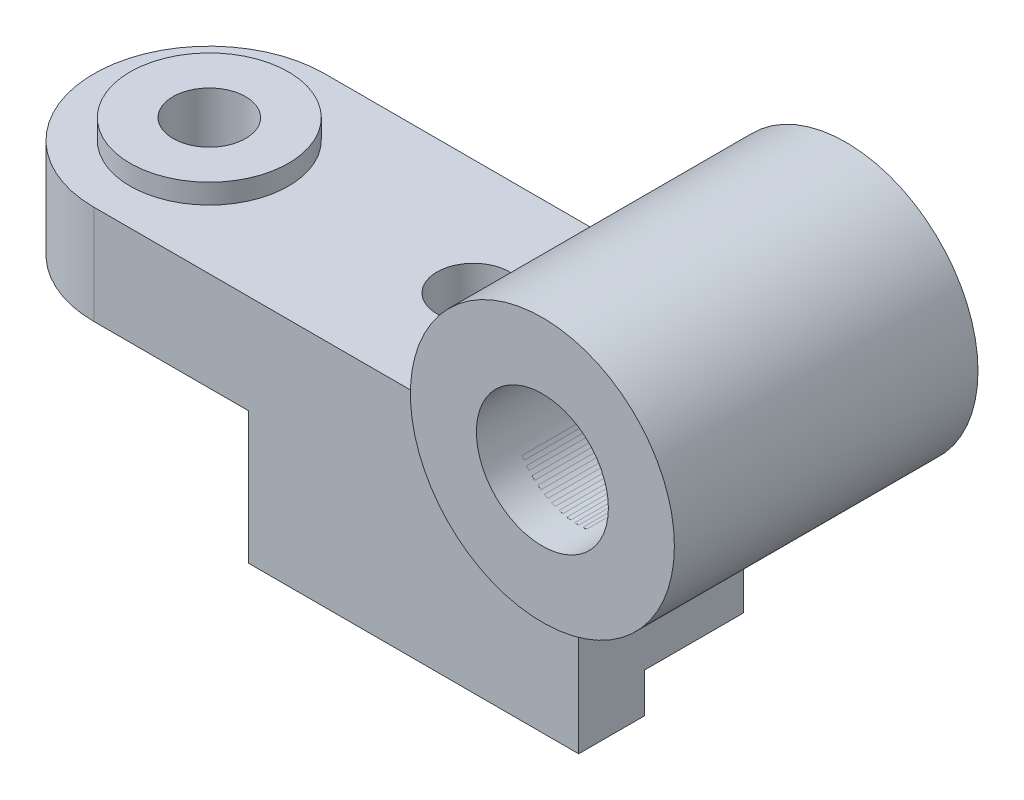
ISO-10303-21;
HEADER;
FILE_DESCRIPTION(('STEP AP214'),'2;1');
FILE_NAME('part.step','',(''),(''),'','','');
FILE_SCHEMA(('AUTOMOTIVE_DESIGN { 1 0 10303 214 1 1 1 1 }'));
ENDSEC;
DATA;
#1=APPLICATION_CONTEXT('core data for automotive mechanical design processes');
#2=APPLICATION_PROTOCOL_DEFINITION('international standard','automotive_design',2000,#1);
#3=PRODUCT_CONTEXT('',#1,'mechanical');
#4=PRODUCT('Part','Part','',(#3));
#5=PRODUCT_RELATED_PRODUCT_CATEGORY('part','',(#4));
#6=PRODUCT_DEFINITION_FORMATION('','',#4);
#7=PRODUCT_DEFINITION_CONTEXT('part definition',#1,'design');
#8=PRODUCT_DEFINITION('design','',#6,#7);
#9=PRODUCT_DEFINITION_SHAPE('','',#8);
#10=(LENGTH_UNIT() NAMED_UNIT(*) SI_UNIT(.MILLI.,.METRE.));
#11=(NAMED_UNIT(*) PLANE_ANGLE_UNIT() SI_UNIT($,.RADIAN.));
#12=(NAMED_UNIT(*) SI_UNIT($,.STERADIAN.) SOLID_ANGLE_UNIT());
#13=UNCERTAINTY_MEASURE_WITH_UNIT(LENGTH_MEASURE(1.E-05),#10,'distance_accuracy_value','');
#14=(GEOMETRIC_REPRESENTATION_CONTEXT(3) GLOBAL_UNCERTAINTY_ASSIGNED_CONTEXT((#13)) GLOBAL_UNIT_ASSIGNED_CONTEXT((#10,
#11,#12)) REPRESENTATION_CONTEXT('',''));
#15=CARTESIAN_POINT('',(0.,0.,0.));
#16=DIRECTION('',(0.,0.,1.));
#17=DIRECTION('',(1.,0.,0.));
#18=AXIS2_PLACEMENT_3D('',#15,#16,#17);
#19=CARTESIAN_POINT('',(0.,0.,-40.5));
#20=DIRECTION('',(0.,0.,1.));
#21=DIRECTION('',(1.,0.,0.));
#22=AXIS2_PLACEMENT_3D('',#19,#20,#21);
#23=CYLINDRICAL_SURFACE('',#22,20.);
#24=CARTESIAN_POINT('',(0.,0.,-40.5));
#25=DIRECTION('',(0.,0.,1.));
#26=DIRECTION('',(1.,0.,0.));
#27=AXIS2_PLACEMENT_3D('',#24,#25,#26);
#28=CIRCLE('',#27,20.);
#29=CARTESIAN_POINT('',(20.,0.,-40.5));
#30=VERTEX_POINT('',#29);
#31=EDGE_CURVE('E11',#30,#30,#28,.T.);
#32=ORIENTED_EDGE('',*,*,#31,.T.);
#33=EDGE_LOOP('',(#32));
#34=FACE_BOUND('',#33,.T.);
#35=CARTESIAN_POINT('',(0.,0.,5.5));
#36=DIRECTION('',(0.,0.,1.));
#37=DIRECTION('',(1.,0.,0.));
#38=AXIS2_PLACEMENT_3D('',#35,#36,#37);
#39=CIRCLE('',#38,20.);
#40=CARTESIAN_POINT('',(20.,0.,5.5));
#41=VERTEX_POINT('',#40);
#42=EDGE_CURVE('E58',#41,#41,#39,.T.);
#43=ORIENTED_EDGE('',*,*,#42,.F.);
#44=EDGE_LOOP('',(#43));
#45=FACE_BOUND('',#44,.T.);
#46=ADVANCED_FACE('F55',(#34,#45),#23,.T.);
#47=CARTESIAN_POINT('',(0.,0.,-40.5));
#48=DIRECTION('',(0.,0.,1.));
#49=DIRECTION('',(1.,0.,0.));
#50=AXIS2_PLACEMENT_3D('',#47,#48,#49);
#51=PLANE('',#50);
#52=CARTESIAN_POINT('',(0.,0.,-40.5));
#53=DIRECTION('',(0.,0.,1.));
#54=DIRECTION('',(1.,0.,0.));
#55=AXIS2_PLACEMENT_3D('',#52,#53,#54);
#56=CIRCLE('',#55,10.);
#57=CARTESIAN_POINT('',(10.,0.,-40.5));
#58=VERTEX_POINT('',#57);
#59=EDGE_CURVE('E65',#58,#58,#56,.T.);
#60=ORIENTED_EDGE('',*,*,#59,.T.);
#61=EDGE_LOOP('',(#60));
#62=FACE_BOUND('',#61,.T.);
#63=ORIENTED_EDGE('',*,*,#31,.F.);
#64=EDGE_LOOP('',(#63));
#65=FACE_BOUND('',#64,.T.);
#66=ADVANCED_FACE('F73',(#62,#65),#51,.F.);
#67=CARTESIAN_POINT('',(0.,0.,5.5));
#68=DIRECTION('',(0.,0.,1.));
#69=DIRECTION('',(1.,0.,0.));
#70=AXIS2_PLACEMENT_3D('',#67,#68,#69);
#71=PLANE('',#70);
#72=CARTESIAN_POINT('',(0.,0.,5.5));
#73=DIRECTION('',(0.,0.,1.));
#74=DIRECTION('',(1.,0.,0.));
#75=AXIS2_PLACEMENT_3D('',#72,#73,#74);
#76=CIRCLE('',#75,10.);
#77=CARTESIAN_POINT('',(10.,0.,5.5));
#78=VERTEX_POINT('',#77);
#79=EDGE_CURVE('E67',#78,#78,#76,.T.);
#80=ORIENTED_EDGE('',*,*,#79,.F.);
#81=EDGE_LOOP('',(#80));
#82=FACE_BOUND('',#81,.T.);
#83=ORIENTED_EDGE('',*,*,#42,.T.);
#84=EDGE_LOOP('',(#83));
#85=FACE_BOUND('',#84,.T.);
#86=ADVANCED_FACE('F79',(#82,#85),#71,.T.);
#87=CARTESIAN_POINT('',(0.,0.,-40.5));
#88=DIRECTION('',(0.,0.,1.));
#89=DIRECTION('',(1.,0.,0.));
#90=AXIS2_PLACEMENT_3D('',#87,#88,#89);
#91=CYLINDRICAL_SURFACE('',#90,10.);
#92=ORIENTED_EDGE('',*,*,#59,.F.);
#93=EDGE_LOOP('',(#92));
#94=FACE_BOUND('',#93,.T.);
#95=ORIENTED_EDGE('',*,*,#79,.T.);
#96=EDGE_LOOP('',(#95));
#97=FACE_BOUND('',#96,.T.);
#98=ADVANCED_FACE('F76',(#94,#97),#91,.F.);
#99=CLOSED_SHELL('',(#46,#66,#86,#98));
#100=MANIFOLD_SOLID_BREP('B2',#99);
#101=CARTESIAN_POINT('',(0.,0.,-10.));
#102=DIRECTION('',(0.,0.,1.));
#103=DIRECTION('',(1.,0.,0.));
#104=AXIS2_PLACEMENT_3D('',#101,#102,#103);
#105=PLANE('',#104);
#106=DIRECTION('',(-1.,0.,0.));
#107=VECTOR('',#106,1.);
#108=CARTESIAN_POINT('',(0.,-34.,-10.));
#109=LINE('',#108,#107);
#110=CARTESIAN_POINT('',(0.,-34.,-10.));
#111=VERTEX_POINT('',#110);
#112=CARTESIAN_POINT('',(-50.,-34.,-10.));
#113=VERTEX_POINT('',#112);
#114=EDGE_CURVE('E140',#111,#113,#109,.T.);
#115=ORIENTED_EDGE('',*,*,#114,.F.);
#116=DIRECTION('',(0.,-1.,0.));
#117=VECTOR('',#116,1.);
#118=CARTESIAN_POINT('',(0.,0.,-10.));
#119=LINE('',#118,#117);
#120=CARTESIAN_POINT('',(0.,-40.,-10.));
#121=VERTEX_POINT('',#120);
#122=EDGE_CURVE('E276',#111,#121,#119,.T.);
#123=ORIENTED_EDGE('',*,*,#122,.T.);
#124=DIRECTION('',(-1.,0.,0.));
#125=VECTOR('',#124,1.);
#126=CARTESIAN_POINT('',(0.,-40.,-10.));
#127=LINE('',#126,#125);
#128=CARTESIAN_POINT('',(-50.,-40.,-10.));
#129=VERTEX_POINT('',#128);
#130=EDGE_CURVE('E271',#121,#129,#127,.T.);
#131=ORIENTED_EDGE('',*,*,#130,.T.);
#132=DIRECTION('',(0.,-1.,0.));
#133=VECTOR('',#132,1.);
#134=CARTESIAN_POINT('',(-50.,0.,-10.));
#135=LINE('',#134,#133);
#136=EDGE_CURVE('E268',#113,#129,#135,.T.);
#137=ORIENTED_EDGE('',*,*,#136,.F.);
#138=EDGE_LOOP('',(#115,#123,#131,#137));
#139=FACE_BOUND('',#138,.T.);
#140=ADVANCED_FACE('F117',(#139),#105,.F.);
#141=CARTESIAN_POINT('',(0.,0.,-10.));
#142=DIRECTION('',(-1.,0.,0.));
#143=DIRECTION('',(0.,-1.,0.));
#144=AXIS2_PLACEMENT_3D('',#141,#142,#143);
#145=PLANE('',#144);
#146=DIRECTION('',(0.,-1.,0.));
#147=VECTOR('',#146,1.);
#148=CARTESIAN_POINT('',(0.,0.,0.));
#149=LINE('',#148,#147);
#150=CARTESIAN_POINT('',(0.,-20.,0.));
#151=VERTEX_POINT('',#150);
#152=CARTESIAN_POINT('',(0.,-40.,0.));
#153=VERTEX_POINT('',#152);
#154=EDGE_CURVE('E272',#151,#153,#149,.T.);
#155=ORIENTED_EDGE('',*,*,#154,.T.);
#156=DIRECTION('',(0.,0.,1.));
#157=VECTOR('',#156,1.);
#158=CARTESIAN_POINT('',(0.,-40.,-10.));
#159=LINE('',#158,#157);
#160=EDGE_CURVE('E291',#121,#153,#159,.T.);
#161=ORIENTED_EDGE('',*,*,#160,.F.);
#162=ORIENTED_EDGE('',*,*,#122,.F.);
#163=DIRECTION('',(0.,0.,1.));
#164=VECTOR('',#163,1.);
#165=CARTESIAN_POINT('',(0.,-34.,-25.));
#166=LINE('',#165,#164);
#167=CARTESIAN_POINT('',(0.,-34.,-25.));
#168=VERTEX_POINT('',#167);
#169=EDGE_CURVE('E263',#168,#111,#166,.T.);
#170=ORIENTED_EDGE('',*,*,#169,.F.);
#171=DIRECTION('',(0.,-1.,0.));
#172=VECTOR('',#171,1.);
#173=CARTESIAN_POINT('',(0.,-20.,-25.));
#174=LINE('',#173,#172);
#175=CARTESIAN_POINT('',(0.,-20.,-25.));
#176=VERTEX_POINT('',#175);
#177=EDGE_CURVE('E243',#176,#168,#174,.T.);
#178=ORIENTED_EDGE('',*,*,#177,.F.);
#179=DIRECTION('',(0.,0.,1.));
#180=VECTOR('',#179,1.);
#181=CARTESIAN_POINT('',(0.,-20.,-10.));
#182=LINE('',#181,#180);
#183=EDGE_CURVE('E126',#176,#151,#182,.T.);
#184=ORIENTED_EDGE('',*,*,#183,.T.);
#185=EDGE_LOOP('',(#155,#161,#162,#170,#178,#184));
#186=FACE_BOUND('',#185,.T.);
#187=ADVANCED_FACE('F385',(#186),#145,.F.);
#188=CARTESIAN_POINT('',(0.,-40.,-10.));
#189=DIRECTION('',(0.,1.,0.));
#190=DIRECTION('',(-1.,0.,0.));
#191=AXIS2_PLACEMENT_3D('',#188,#189,#190);
#192=PLANE('',#191);
#193=DIRECTION('',(-1.,0.,0.));
#194=VECTOR('',#193,1.);
#195=CARTESIAN_POINT('',(0.,-40.,0.));
#196=LINE('',#195,#194);
#197=CARTESIAN_POINT('',(-50.,-40.,0.));
#198=VERTEX_POINT('',#197);
#199=EDGE_CURVE('E283',#153,#198,#196,.T.);
#200=ORIENTED_EDGE('',*,*,#199,.T.);
#201=DIRECTION('',(0.,0.,1.));
#202=VECTOR('',#201,1.);
#203=CARTESIAN_POINT('',(-50.,-40.,-10.));
#204=LINE('',#203,#202);
#205=EDGE_CURVE('E295',#129,#198,#204,.T.);
#206=ORIENTED_EDGE('',*,*,#205,.F.);
#207=ORIENTED_EDGE('',*,*,#130,.F.);
#208=ORIENTED_EDGE('',*,*,#160,.T.);
#209=EDGE_LOOP('',(#200,#206,#207,#208));
#210=FACE_BOUND('',#209,.T.);
#211=ADVANCED_FACE('F391',(#210),#192,.F.);
#212=CARTESIAN_POINT('',(-50.,0.,-10.));
#213=DIRECTION('',(-1.,0.,0.));
#214=DIRECTION('',(0.,-1.,0.));
#215=AXIS2_PLACEMENT_3D('',#212,#213,#214);
#216=PLANE('',#215);
#217=DIRECTION('',(0.,-1.,0.));
#218=VECTOR('',#217,1.);
#219=CARTESIAN_POINT('',(-50.,0.,0.));
#220=LINE('',#219,#218);
#221=CARTESIAN_POINT('',(-50.,-20.,0.));
#222=VERTEX_POINT('',#221);
#223=EDGE_CURVE('E267',#222,#198,#220,.T.);
#224=ORIENTED_EDGE('',*,*,#223,.F.);
#225=DIRECTION('',(0.,0.,1.));
#226=VECTOR('',#225,1.);
#227=CARTESIAN_POINT('',(-50.,-20.,-10.));
#228=LINE('',#227,#226);
#229=CARTESIAN_POINT('',(-50.,-20.,-25.));
#230=VERTEX_POINT('',#229);
#231=EDGE_CURVE('E279',#230,#222,#228,.T.);
#232=ORIENTED_EDGE('',*,*,#231,.F.);
#233=DIRECTION('',(0.,1.,0.));
#234=VECTOR('',#233,1.);
#235=CARTESIAN_POINT('',(-50.,-20.,-25.));
#236=LINE('',#235,#234);
#237=CARTESIAN_POINT('',(-50.,-34.,-25.));
#238=VERTEX_POINT('',#237);
#239=EDGE_CURVE('E250',#238,#230,#236,.T.);
#240=ORIENTED_EDGE('',*,*,#239,.F.);
#241=DIRECTION('',(0.,0.,1.));
#242=VECTOR('',#241,1.);
#243=CARTESIAN_POINT('',(-50.,-34.,-25.));
#244=LINE('',#243,#242);
#245=EDGE_CURVE('E257',#238,#113,#244,.T.);
#246=ORIENTED_EDGE('',*,*,#245,.T.);
#247=ORIENTED_EDGE('',*,*,#136,.T.);
#248=ORIENTED_EDGE('',*,*,#205,.T.);
#249=EDGE_LOOP('',(#224,#232,#240,#246,#247,#248));
#250=FACE_BOUND('',#249,.T.);
#251=ADVANCED_FACE('F119',(#250),#216,.T.);
#252=CARTESIAN_POINT('',(0.,0.,0.));
#253=DIRECTION('',(0.,0.,1.));
#254=DIRECTION('',(1.,0.,0.));
#255=AXIS2_PLACEMENT_3D('',#252,#253,#254);
#256=PLANE('',#255);
#257=CARTESIAN_POINT('',(0.,0.,0.));
#258=DIRECTION('',(0.,0.,1.));
#259=DIRECTION('',(1.,0.,0.));
#260=AXIS2_PLACEMENT_3D('',#257,#258,#259);
#261=CIRCLE('',#260,10.);
#262=CARTESIAN_POINT('',(-8.66025403784439,-5.,0.));
#263=VERTEX_POINT('',#262);
#264=CARTESIAN_POINT('',(1.53399290405787,-9.88164286798001,0.));
#265=VERTEX_POINT('',#264);
#266=EDGE_CURVE('E199',#263,#265,#261,.T.);
#267=ORIENTED_EDGE('',*,*,#266,.F.);
#268=DIRECTION('',(1.,0.,0.));
#269=VECTOR('',#268,1.);
#270=CARTESIAN_POINT('',(-15.9537464377131,-5.,0.));
#271=LINE('',#270,#269);
#272=CARTESIAN_POINT('',(-73.4660070959421,-5.00000000000001,0.));
#273=VERTEX_POINT('',#272);
#274=EDGE_CURVE('E207',#273,#263,#271,.T.);
#275=ORIENTED_EDGE('',*,*,#274,.F.);
#276=DIRECTION('',(0.,1.,0.));
#277=VECTOR('',#276,1.);
#278=CARTESIAN_POINT('',(-73.4660070959421,-20.,0.));
#279=LINE('',#278,#277);
#280=CARTESIAN_POINT('',(-73.4660070959421,-20.,0.));
#281=VERTEX_POINT('',#280);
#282=EDGE_CURVE('E235',#281,#273,#279,.T.);
#283=ORIENTED_EDGE('',*,*,#282,.F.);
#284=DIRECTION('',(1.,0.,0.));
#285=VECTOR('',#284,1.);
#286=CARTESIAN_POINT('',(-73.4660070959421,-20.,0.));
#287=LINE('',#286,#285);
#288=EDGE_CURVE('E306',#281,#222,#287,.T.);
#289=ORIENTED_EDGE('',*,*,#288,.T.);
#290=ORIENTED_EDGE('',*,*,#223,.T.);
#291=ORIENTED_EDGE('',*,*,#199,.F.);
#292=ORIENTED_EDGE('',*,*,#154,.F.);
#293=CARTESIAN_POINT('',(1.53399290405787,-20.,0.));
#294=VERTEX_POINT('',#293);
#295=EDGE_CURVE('E312',#151,#294,#287,.T.);
#296=ORIENTED_EDGE('',*,*,#295,.T.);
#297=DIRECTION('',(0.,1.,0.));
#298=VECTOR('',#297,1.);
#299=CARTESIAN_POINT('',(1.53399290405787,-20.,0.));
#300=LINE('',#299,#298);
#301=EDGE_CURVE('E210',#294,#265,#300,.T.);
#302=ORIENTED_EDGE('',*,*,#301,.T.);
#303=EDGE_LOOP('',(#267,#275,#283,#289,#290,#291,#292,#296,#302));
#304=FACE_BOUND('',#303,.T.);
#305=ADVANCED_FACE('F206',(#304),#256,.T.);
#306=CARTESIAN_POINT('',(0.,-34.,-25.));
#307=DIRECTION('',(0.,1.,0.));
#308=DIRECTION('',(0.,0.,1.));
#309=AXIS2_PLACEMENT_3D('',#306,#307,#308);
#310=PLANE('',#309);
#311=CARTESIAN_POINT('',(-33.4660070959421,-34.,-17.5));
#312=DIRECTION('',(0.,1.,0.));
#313=DIRECTION('',(0.,0.,1.));
#314=AXIS2_PLACEMENT_3D('',#311,#312,#313);
#315=CIRCLE('',#314,5.5);
#316=CARTESIAN_POINT('',(-33.4660070959421,-34.,-12.));
#317=VERTEX_POINT('',#316);
#318=EDGE_CURVE('E352',#317,#317,#315,.T.);
#319=ORIENTED_EDGE('',*,*,#318,.T.);
#320=EDGE_LOOP('',(#319));
#321=FACE_BOUND('',#320,.T.);
#322=ORIENTED_EDGE('',*,*,#114,.T.);
#323=ORIENTED_EDGE('',*,*,#245,.F.);
#324=DIRECTION('',(-1.,0.,0.));
#325=VECTOR('',#324,1.);
#326=CARTESIAN_POINT('',(0.,-34.,-25.));
#327=LINE('',#326,#325);
#328=EDGE_CURVE('E247',#168,#238,#327,.T.);
#329=ORIENTED_EDGE('',*,*,#328,.F.);
#330=ORIENTED_EDGE('',*,*,#169,.T.);
#331=EDGE_LOOP('',(#322,#323,#329,#330));
#332=FACE_BOUND('',#331,.T.);
#333=ADVANCED_FACE('F396',(#321,#332),#310,.F.);
#334=CARTESIAN_POINT('',(0.,0.,-25.));
#335=DIRECTION('',(0.,0.,-1.));
#336=DIRECTION('',(-1.,0.,0.));
#337=AXIS2_PLACEMENT_3D('',#334,#335,#336);
#338=PLANE('',#337);
#339=ORIENTED_EDGE('',*,*,#177,.T.);
#340=ORIENTED_EDGE('',*,*,#328,.T.);
#341=ORIENTED_EDGE('',*,*,#239,.T.);
#342=DIRECTION('',(1.,0.,0.));
#343=VECTOR('',#342,1.);
#344=CARTESIAN_POINT('',(0.,-20.,-25.));
#345=LINE('',#344,#343);
#346=EDGE_CURVE('E254',#230,#176,#345,.T.);
#347=ORIENTED_EDGE('',*,*,#346,.T.);
#348=EDGE_LOOP('',(#339,#340,#341,#347));
#349=FACE_BOUND('',#348,.T.);
#350=ADVANCED_FACE('F410',(#349),#338,.T.);
#351=CARTESIAN_POINT('',(1.53399290405787,-20.,-35.));
#352=DIRECTION('',(1.,0.,0.));
#353=DIRECTION('',(0.,1.,0.));
#354=AXIS2_PLACEMENT_3D('',#351,#352,#353);
#355=PLANE('',#354);
#356=DIRECTION('',(0.,0.,1.));
#357=VECTOR('',#356,1.);
#358=CARTESIAN_POINT('',(1.53399290405787,-9.88164286798001,-56.5));
#359=LINE('',#358,#357);
#360=CARTESIAN_POINT('',(1.53399290405787,-9.88164286798001,-35.));
#361=VERTEX_POINT('',#360);
#362=EDGE_CURVE('E213',#265,#361,#359,.F.);
#363=ORIENTED_EDGE('',*,*,#362,.F.);
#364=ORIENTED_EDGE('',*,*,#301,.F.);
#365=DIRECTION('',(0.,0.,-1.));
#366=VECTOR('',#365,1.);
#367=CARTESIAN_POINT('',(1.53399290405787,-20.,-35.));
#368=LINE('',#367,#366);
#369=CARTESIAN_POINT('',(1.53399290405787,-20.,-35.));
#370=VERTEX_POINT('',#369);
#371=EDGE_CURVE('E242',#294,#370,#368,.T.);
#372=ORIENTED_EDGE('',*,*,#371,.T.);
#373=DIRECTION('',(0.,1.,0.));
#374=VECTOR('',#373,1.);
#375=CARTESIAN_POINT('',(1.53399290405787,-20.,-35.));
#376=LINE('',#375,#374);
#377=EDGE_CURVE('E229',#370,#361,#376,.T.);
#378=ORIENTED_EDGE('',*,*,#377,.T.);
#379=EDGE_LOOP('',(#363,#364,#372,#378));
#380=FACE_BOUND('',#379,.T.);
#381=ADVANCED_FACE('F330',(#380),#355,.T.);
#382=CARTESIAN_POINT('',(-73.4660070959421,-20.,-17.5));
#383=DIRECTION('',(0.,1.,0.));
#384=DIRECTION('',(-1.,0.,0.));
#385=AXIS2_PLACEMENT_3D('',#382,#383,#384);
#386=CYLINDRICAL_SURFACE('',#385,17.5);
#387=CARTESIAN_POINT('',(-73.4660070959421,-5.00000000000001,-17.5));
#388=DIRECTION('',(0.,1.,0.));
#389=DIRECTION('',(-1.,0.,0.));
#390=AXIS2_PLACEMENT_3D('',#387,#388,#389);
#391=CIRCLE('',#390,17.5);
#392=CARTESIAN_POINT('',(-73.4660070959421,-5.00000000000001,-35.));
#393=VERTEX_POINT('',#392);
#394=EDGE_CURVE('E218',#393,#273,#391,.T.);
#395=ORIENTED_EDGE('',*,*,#394,.F.);
#396=DIRECTION('',(0.,1.,0.));
#397=VECTOR('',#396,1.);
#398=CARTESIAN_POINT('',(-73.4660070959421,-20.,-35.));
#399=LINE('',#398,#397);
#400=CARTESIAN_POINT('',(-73.4660070959421,-20.,-35.));
#401=VERTEX_POINT('',#400);
#402=EDGE_CURVE('E238',#401,#393,#399,.T.);
#403=ORIENTED_EDGE('',*,*,#402,.F.);
#404=CARTESIAN_POINT('',(-73.4660070959421,-20.,-17.5));
#405=DIRECTION('',(0.,1.,0.));
#406=DIRECTION('',(-1.,0.,0.));
#407=AXIS2_PLACEMENT_3D('',#404,#405,#406);
#408=CIRCLE('',#407,17.5);
#409=EDGE_CURVE('E224',#401,#281,#408,.T.);
#410=ORIENTED_EDGE('',*,*,#409,.T.);
#411=ORIENTED_EDGE('',*,*,#282,.T.);
#412=EDGE_LOOP('',(#395,#403,#410,#411));
#413=FACE_BOUND('',#412,.T.);
#414=ADVANCED_FACE('F325',(#413),#386,.T.);
#415=CARTESIAN_POINT('',(-20.,-20.,-35.));
#416=DIRECTION('',(0.,0.,-1.));
#417=DIRECTION('',(-1.,0.,0.));
#418=AXIS2_PLACEMENT_3D('',#415,#416,#417);
#419=PLANE('',#418);
#420=CARTESIAN_POINT('',(0.,0.,-35.));
#421=DIRECTION('',(0.,0.,-1.));
#422=DIRECTION('',(-1.,0.,0.));
#423=AXIS2_PLACEMENT_3D('',#420,#421,#422);
#424=CIRCLE('',#423,10.);
#425=CARTESIAN_POINT('',(-8.66025403784439,-5.,-35.));
#426=VERTEX_POINT('',#425);
#427=EDGE_CURVE('E132',#361,#426,#424,.T.);
#428=ORIENTED_EDGE('',*,*,#427,.F.);
#429=ORIENTED_EDGE('',*,*,#377,.F.);
#430=DIRECTION('',(-1.,0.,0.));
#431=VECTOR('',#430,1.);
#432=CARTESIAN_POINT('',(-15.9537464377131,-20.,-35.));
#433=LINE('',#432,#431);
#434=EDGE_CURVE('E220',#370,#401,#433,.T.);
#435=ORIENTED_EDGE('',*,*,#434,.T.);
#436=ORIENTED_EDGE('',*,*,#402,.T.);
#437=DIRECTION('',(-1.,0.,0.));
#438=VECTOR('',#437,1.);
#439=CARTESIAN_POINT('',(-20.,-5.,-35.));
#440=LINE('',#439,#438);
#441=EDGE_CURVE('E212',#426,#393,#440,.T.);
#442=ORIENTED_EDGE('',*,*,#441,.F.);
#443=EDGE_LOOP('',(#428,#429,#435,#436,#442));
#444=FACE_BOUND('',#443,.T.);
#445=ADVANCED_FACE('F322',(#444),#419,.T.);
#446=CARTESIAN_POINT('',(-73.4660070959421,-20.,-17.5));
#447=DIRECTION('',(0.,1.,0.));
#448=DIRECTION('',(-1.,0.,0.));
#449=AXIS2_PLACEMENT_3D('',#446,#447,#448);
#450=PLANE('',#449);
#451=CARTESIAN_POINT('',(-73.4660070959421,-20.,-17.5));
#452=DIRECTION('',(0.,1.,0.));
#453=DIRECTION('',(-1.,0.,0.));
#454=AXIS2_PLACEMENT_3D('',#451,#452,#453);
#455=CIRCLE('',#454,5.49999999999999);
#456=CARTESIAN_POINT('',(-78.9660070959421,-20.,-17.5));
#457=VERTEX_POINT('',#456);
#458=EDGE_CURVE('E341',#457,#457,#455,.T.);
#459=ORIENTED_EDGE('',*,*,#458,.T.);
#460=EDGE_LOOP('',(#459));
#461=FACE_BOUND('',#460,.T.);
#462=ORIENTED_EDGE('',*,*,#183,.F.);
#463=ORIENTED_EDGE('',*,*,#346,.F.);
#464=ORIENTED_EDGE('',*,*,#231,.T.);
#465=ORIENTED_EDGE('',*,*,#288,.F.);
#466=ORIENTED_EDGE('',*,*,#409,.F.);
#467=ORIENTED_EDGE('',*,*,#434,.F.);
#468=ORIENTED_EDGE('',*,*,#371,.F.);
#469=ORIENTED_EDGE('',*,*,#295,.F.);
#470=EDGE_LOOP('',(#462,#463,#464,#465,#466,#467,#468,#469));
#471=FACE_BOUND('',#470,.T.);
#472=ADVANCED_FACE('F304',(#461,#471),#450,.F.);
#473=CARTESIAN_POINT('',(-73.4660070959421,-5.00000000000001,-17.5));
#474=DIRECTION('',(0.,1.,0.));
#475=DIRECTION('',(-1.,0.,0.));
#476=AXIS2_PLACEMENT_3D('',#473,#474,#475);
#477=PLANE('',#476);
#478=CARTESIAN_POINT('',(-33.4660070959421,-5.00000000000001,-17.5));
#479=DIRECTION('',(0.,1.,0.));
#480=DIRECTION('',(-1.,0.,0.));
#481=AXIS2_PLACEMENT_3D('',#478,#479,#480);
#482=CIRCLE('',#481,5.5);
#483=CARTESIAN_POINT('',(-38.9660070959421,-5.00000000000001,-17.5));
#484=VERTEX_POINT('',#483);
#485=EDGE_CURVE('E356',#484,#484,#482,.T.);
#486=ORIENTED_EDGE('',*,*,#485,.F.);
#487=EDGE_LOOP('',(#486));
#488=FACE_BOUND('',#487,.T.);
#489=CARTESIAN_POINT('',(-73.4660070959421,-5.00000000000001,-17.5));
#490=DIRECTION('',(0.,1.,0.));
#491=DIRECTION('',(-1.,0.,0.));
#492=AXIS2_PLACEMENT_3D('',#489,#490,#491);
#493=CIRCLE('',#492,12.);
#494=CARTESIAN_POINT('',(-85.4660070959421,-5.00000000000001,-17.5));
#495=VERTEX_POINT('',#494);
#496=EDGE_CURVE('E337',#495,#495,#493,.T.);
#497=ORIENTED_EDGE('',*,*,#496,.F.);
#498=EDGE_LOOP('',(#497));
#499=FACE_BOUND('',#498,.T.);
#500=DIRECTION('',(0.,0.,1.));
#501=VECTOR('',#500,1.);
#502=CARTESIAN_POINT('',(-8.66025403784439,-5.,-56.5));
#503=LINE('',#502,#501);
#504=EDGE_CURVE('E53',#426,#263,#503,.T.);
#505=ORIENTED_EDGE('',*,*,#504,.F.);
#506=ORIENTED_EDGE('',*,*,#441,.T.);
#507=ORIENTED_EDGE('',*,*,#394,.T.);
#508=ORIENTED_EDGE('',*,*,#274,.T.);
#509=EDGE_LOOP('',(#505,#506,#507,#508));
#510=FACE_BOUND('',#509,.T.);
#511=ADVANCED_FACE('F216',(#488,#499,#510),#477,.T.);
#512=CARTESIAN_POINT('',(0.,0.,-56.5));
#513=DIRECTION('',(0.,0.,1.));
#514=DIRECTION('',(1.,0.,0.));
#515=AXIS2_PLACEMENT_3D('',#512,#513,#514);
#516=CYLINDRICAL_SURFACE('',#515,10.);
#517=ORIENTED_EDGE('',*,*,#266,.T.);
#518=ORIENTED_EDGE('',*,*,#362,.T.);
#519=ORIENTED_EDGE('',*,*,#427,.T.);
#520=ORIENTED_EDGE('',*,*,#504,.T.);
#521=EDGE_LOOP('',(#517,#518,#519,#520));
#522=FACE_BOUND('',#521,.T.);
#523=ADVANCED_FACE('F198',(#522),#516,.F.);
#524=CARTESIAN_POINT('',(-73.4660070959421,-2.00000000000001,-17.5));
#525=DIRECTION('',(0.,-1.,0.));
#526=DIRECTION('',(1.,0.,0.));
#527=AXIS2_PLACEMENT_3D('',#524,#525,#526);
#528=CYLINDRICAL_SURFACE('',#527,12.);
#529=CARTESIAN_POINT('',(-73.4660070959421,-2.00000000000001,-17.5));
#530=DIRECTION('',(0.,1.,0.));
#531=DIRECTION('',(-1.,0.,0.));
#532=AXIS2_PLACEMENT_3D('',#529,#530,#531);
#533=CIRCLE('',#532,12.);
#534=CARTESIAN_POINT('',(-85.4660070959421,-2.00000000000001,-17.5));
#535=VERTEX_POINT('',#534);
#536=EDGE_CURVE('E334',#535,#535,#533,.T.);
#537=ORIENTED_EDGE('',*,*,#536,.F.);
#538=EDGE_LOOP('',(#537));
#539=FACE_BOUND('',#538,.T.);
#540=ORIENTED_EDGE('',*,*,#496,.T.);
#541=EDGE_LOOP('',(#540));
#542=FACE_BOUND('',#541,.T.);
#543=ADVANCED_FACE('F369',(#539,#542),#528,.T.);
#544=CARTESIAN_POINT('',(-73.4660070959421,-2.00000000000001,-17.5));
#545=DIRECTION('',(0.,1.,0.));
#546=DIRECTION('',(-1.,0.,0.));
#547=AXIS2_PLACEMENT_3D('',#544,#545,#546);
#548=PLANE('',#547);
#549=CARTESIAN_POINT('',(-73.4660070959421,-2.00000000000001,-17.5));
#550=DIRECTION('',(0.,1.,0.));
#551=DIRECTION('',(-1.,0.,0.));
#552=AXIS2_PLACEMENT_3D('',#549,#550,#551);
#553=CIRCLE('',#552,5.49999999999999);
#554=CARTESIAN_POINT('',(-78.9660070959421,-2.00000000000001,-17.5));
#555=VERTEX_POINT('',#554);
#556=EDGE_CURVE('E348',#555,#555,#553,.T.);
#557=ORIENTED_EDGE('',*,*,#556,.F.);
#558=EDGE_LOOP('',(#557));
#559=FACE_BOUND('',#558,.T.);
#560=ORIENTED_EDGE('',*,*,#536,.T.);
#561=EDGE_LOOP('',(#560));
#562=FACE_BOUND('',#561,.T.);
#563=ADVANCED_FACE('F371',(#559,#562),#548,.T.);
#564=CARTESIAN_POINT('',(-73.4660070959421,-35.,-17.5));
#565=DIRECTION('',(0.,1.,0.));
#566=DIRECTION('',(-1.,0.,0.));
#567=AXIS2_PLACEMENT_3D('',#564,#565,#566);
#568=CYLINDRICAL_SURFACE('',#567,5.49999999999999);
#569=ORIENTED_EDGE('',*,*,#556,.T.);
#570=EDGE_LOOP('',(#569));
#571=FACE_BOUND('',#570,.T.);
#572=ORIENTED_EDGE('',*,*,#458,.F.);
#573=EDGE_LOOP('',(#572));
#574=FACE_BOUND('',#573,.T.);
#575=ADVANCED_FACE('F379',(#571,#574),#568,.F.);
#576=CARTESIAN_POINT('',(-33.4660070959421,-38.,-17.5));
#577=DIRECTION('',(0.,1.,0.));
#578=DIRECTION('',(-1.,0.,0.));
#579=AXIS2_PLACEMENT_3D('',#576,#577,#578);
#580=CYLINDRICAL_SURFACE('',#579,5.5);
#581=ORIENTED_EDGE('',*,*,#485,.T.);
#582=EDGE_LOOP('',(#581));
#583=FACE_BOUND('',#582,.T.);
#584=ORIENTED_EDGE('',*,*,#318,.F.);
#585=EDGE_LOOP('',(#584));
#586=FACE_BOUND('',#585,.T.);
#587=ADVANCED_FACE('F361',(#583,#586),#580,.F.);
#588=CLOSED_SHELL('',(#140,#187,#211,#251,#305,#333,#350,#381,#414,#445,#472,#511,#523,#543,
#563,#575,#587));
#589=MANIFOLD_SOLID_BREP('B6',#588);
#590=ADVANCED_BREP_SHAPE_REPRESENTATION('',(#18,#100,#589),#14);
#591=SHAPE_DEFINITION_REPRESENTATION(#9,#590);
ENDSEC;
END-ISO-10303-21;
